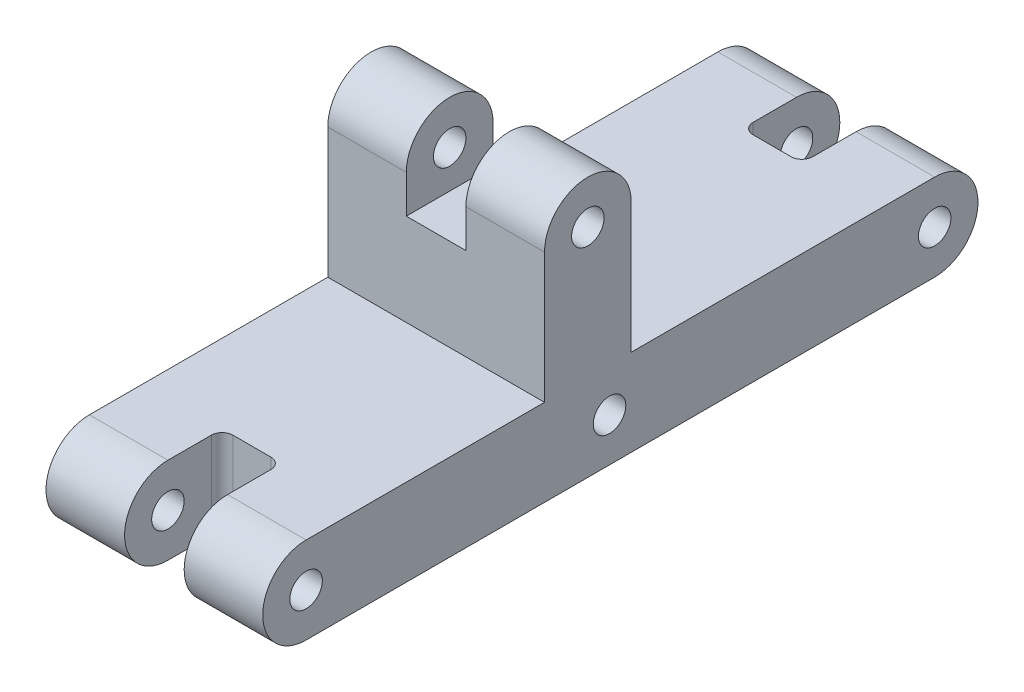
ISO-10303-21;
HEADER;
FILE_DESCRIPTION(('STEP AP214'),'2;1');
FILE_NAME('part.step','',(''),(''),'','','');
FILE_SCHEMA(('AUTOMOTIVE_DESIGN { 1 0 10303 214 1 1 1 1 }'));
ENDSEC;
DATA;
#1=APPLICATION_CONTEXT('core data for automotive mechanical design processes');
#2=APPLICATION_PROTOCOL_DEFINITION('international standard','automotive_design',2000,#1);
#3=PRODUCT_CONTEXT('',#1,'mechanical');
#4=PRODUCT('Part','Part','',(#3));
#5=PRODUCT_RELATED_PRODUCT_CATEGORY('part','',(#4));
#6=PRODUCT_DEFINITION_FORMATION('','',#4);
#7=PRODUCT_DEFINITION_CONTEXT('part definition',#1,'design');
#8=PRODUCT_DEFINITION('design','',#6,#7);
#9=PRODUCT_DEFINITION_SHAPE('','',#8);
#10=(LENGTH_UNIT() NAMED_UNIT(*) SI_UNIT(.MILLI.,.METRE.));
#11=(NAMED_UNIT(*) PLANE_ANGLE_UNIT() SI_UNIT($,.RADIAN.));
#12=(NAMED_UNIT(*) SI_UNIT($,.STERADIAN.) SOLID_ANGLE_UNIT());
#13=UNCERTAINTY_MEASURE_WITH_UNIT(LENGTH_MEASURE(1.E-05),#10,'distance_accuracy_value','');
#14=(GEOMETRIC_REPRESENTATION_CONTEXT(3) GLOBAL_UNCERTAINTY_ASSIGNED_CONTEXT((#13)) GLOBAL_UNIT_ASSIGNED_CONTEXT((#10,
#11,#12)) REPRESENTATION_CONTEXT('',''));
#15=CARTESIAN_POINT('',(0.,0.,0.));
#16=DIRECTION('',(0.,0.,1.));
#17=DIRECTION('',(1.,0.,0.));
#18=AXIS2_PLACEMENT_3D('',#15,#16,#17);
#19=CARTESIAN_POINT('',(10.,0.,43.));
#20=DIRECTION('',(-1.,0.,0.));
#21=DIRECTION('',(0.,0.,1.));
#22=AXIS2_PLACEMENT_3D('',#19,#20,#21);
#23=CYLINDRICAL_SURFACE('',#22,3.99999999999999);
#24=CARTESIAN_POINT('',(2.75,0.,43.));
#25=DIRECTION('',(-1.,0.,0.));
#26=DIRECTION('',(0.,0.,1.));
#27=AXIS2_PLACEMENT_3D('',#24,#25,#26);
#28=CIRCLE('',#27,3.99999999999999);
#29=CARTESIAN_POINT('',(2.75,-3.99999999999999,43.));
#30=VERTEX_POINT('',#29);
#31=CARTESIAN_POINT('',(2.75,4.,43.));
#32=VERTEX_POINT('',#31);
#33=EDGE_CURVE('E256',#30,#32,#28,.T.);
#34=ORIENTED_EDGE('',*,*,#33,.F.);
#35=DIRECTION('',(-1.,0.,0.));
#36=VECTOR('',#35,1.);
#37=CARTESIAN_POINT('',(10.,-3.99999999999999,43.));
#38=LINE('',#37,#36);
#39=CARTESIAN_POINT('',(10.,-3.99999999999999,43.));
#40=VERTEX_POINT('',#39);
#41=EDGE_CURVE('E359',#40,#30,#38,.T.);
#42=ORIENTED_EDGE('',*,*,#41,.F.);
#43=CARTESIAN_POINT('',(10.,0.,43.));
#44=DIRECTION('',(1.,0.,0.));
#45=DIRECTION('',(0.,0.,-1.));
#46=AXIS2_PLACEMENT_3D('',#43,#44,#45);
#47=CIRCLE('',#46,3.99999999999999);
#48=CARTESIAN_POINT('',(10.,3.99999999999999,43.));
#49=VERTEX_POINT('',#48);
#50=EDGE_CURVE('E302',#49,#40,#47,.T.);
#51=ORIENTED_EDGE('',*,*,#50,.F.);
#52=DIRECTION('',(-1.,0.,0.));
#53=VECTOR('',#52,1.);
#54=CARTESIAN_POINT('',(10.,3.99999999999999,43.));
#55=LINE('',#54,#53);
#56=EDGE_CURVE('E363',#49,#32,#55,.T.);
#57=ORIENTED_EDGE('',*,*,#56,.T.);
#58=EDGE_LOOP('',(#34,#42,#51,#57));
#59=FACE_BOUND('',#58,.T.);
#60=ADVANCED_FACE('F33',(#59),#23,.T.);
#61=CARTESIAN_POINT('',(10.,-4.,15.));
#62=DIRECTION('',(0.,1.,0.));
#63=DIRECTION('',(0.,0.,1.));
#64=AXIS2_PLACEMENT_3D('',#61,#62,#63);
#65=PLANE('',#64);
#66=DIRECTION('',(1.,0.,0.));
#67=VECTOR('',#66,1.);
#68=CARTESIAN_POINT('',(-2.75,-3.99999999999999,38.));
#69=LINE('',#68,#67);
#70=CARTESIAN_POINT('',(-1.75,-3.99999999999999,38.));
#71=VERTEX_POINT('',#70);
#72=CARTESIAN_POINT('',(1.75,-3.99999999999999,38.));
#73=VERTEX_POINT('',#72);
#74=EDGE_CURVE('E236',#71,#73,#69,.T.);
#75=ORIENTED_EDGE('',*,*,#74,.F.);
#76=CARTESIAN_POINT('',(-1.75,-4.,39.));
#77=DIRECTION('',(0.,1.,0.));
#78=DIRECTION('',(0.,0.,1.));
#79=AXIS2_PLACEMENT_3D('',#76,#77,#78);
#80=CIRCLE('',#79,1.);
#81=CARTESIAN_POINT('',(-2.75,-3.99999999999999,39.));
#82=VERTEX_POINT('',#81);
#83=EDGE_CURVE('E11',#71,#82,#80,.T.);
#84=ORIENTED_EDGE('',*,*,#83,.T.);
#85=DIRECTION('',(0.,0.,-1.));
#86=VECTOR('',#85,1.);
#87=CARTESIAN_POINT('',(-2.75,-3.99999999999999,38.));
#88=LINE('',#87,#86);
#89=CARTESIAN_POINT('',(-2.75,-3.99999999999999,43.));
#90=VERTEX_POINT('',#89);
#91=EDGE_CURVE('E227',#90,#82,#88,.T.);
#92=ORIENTED_EDGE('',*,*,#91,.F.);
#93=CARTESIAN_POINT('',(-10.,-3.99999999999999,43.));
#94=VERTEX_POINT('',#93);
#95=EDGE_CURVE('E358',#90,#94,#38,.T.);
#96=ORIENTED_EDGE('',*,*,#95,.T.);
#97=DIRECTION('',(0.,0.,-1.));
#98=VECTOR('',#97,1.);
#99=CARTESIAN_POINT('',(-10.,-4.,15.));
#100=LINE('',#99,#98);
#101=CARTESIAN_POINT('',(-10.,-4.,-15.));
#102=VERTEX_POINT('',#101);
#103=EDGE_CURVE('E323',#94,#102,#100,.T.);
#104=ORIENTED_EDGE('',*,*,#103,.T.);
#105=DIRECTION('',(-1.,0.,0.));
#106=VECTOR('',#105,1.);
#107=CARTESIAN_POINT('',(10.,-4.,-15.));
#108=LINE('',#107,#106);
#109=CARTESIAN_POINT('',(-2.75,-3.99999999999999,-15.));
#110=VERTEX_POINT('',#109);
#111=EDGE_CURVE('E354',#110,#102,#108,.T.);
#112=ORIENTED_EDGE('',*,*,#111,.F.);
#113=DIRECTION('',(0.,0.,-1.));
#114=VECTOR('',#113,1.);
#115=CARTESIAN_POINT('',(-2.75,-3.99999999999999,-10.));
#116=LINE('',#115,#114);
#117=CARTESIAN_POINT('',(-2.75,-3.99999999999999,-11.));
#118=VERTEX_POINT('',#117);
#119=EDGE_CURVE('E241',#118,#110,#116,.T.);
#120=ORIENTED_EDGE('',*,*,#119,.F.);
#121=CARTESIAN_POINT('',(-1.75,-4.,-11.));
#122=DIRECTION('',(0.,1.,0.));
#123=DIRECTION('',(0.,0.,1.));
#124=AXIS2_PLACEMENT_3D('',#121,#122,#123);
#125=CIRCLE('',#124,1.);
#126=CARTESIAN_POINT('',(-1.75,-3.99999999999999,-10.));
#127=VERTEX_POINT('',#126);
#128=EDGE_CURVE('E401',#118,#127,#125,.T.);
#129=ORIENTED_EDGE('',*,*,#128,.T.);
#130=DIRECTION('',(1.,0.,0.));
#131=VECTOR('',#130,1.);
#132=CARTESIAN_POINT('',(-2.75,-3.99999999999999,-10.));
#133=LINE('',#132,#131);
#134=CARTESIAN_POINT('',(1.75,-3.99999999999999,-10.));
#135=VERTEX_POINT('',#134);
#136=EDGE_CURVE('E247',#127,#135,#133,.T.);
#137=ORIENTED_EDGE('',*,*,#136,.T.);
#138=CARTESIAN_POINT('',(1.75,-4.,-11.));
#139=DIRECTION('',(0.,1.,0.));
#140=DIRECTION('',(0.,0.,1.));
#141=AXIS2_PLACEMENT_3D('',#138,#139,#140);
#142=CIRCLE('',#141,1.);
#143=CARTESIAN_POINT('',(2.75,-3.99999999999999,-11.));
#144=VERTEX_POINT('',#143);
#145=EDGE_CURVE('E397',#135,#144,#142,.T.);
#146=ORIENTED_EDGE('',*,*,#145,.T.);
#147=DIRECTION('',(0.,0.,-1.));
#148=VECTOR('',#147,1.);
#149=CARTESIAN_POINT('',(2.75,-3.99999999999999,-10.));
#150=LINE('',#149,#148);
#151=CARTESIAN_POINT('',(2.75,-3.99999999999999,-15.));
#152=VERTEX_POINT('',#151);
#153=EDGE_CURVE('E248',#144,#152,#150,.T.);
#154=ORIENTED_EDGE('',*,*,#153,.T.);
#155=CARTESIAN_POINT('',(10.,-4.,-15.));
#156=VERTEX_POINT('',#155);
#157=EDGE_CURVE('E355',#156,#152,#108,.T.);
#158=ORIENTED_EDGE('',*,*,#157,.F.);
#159=DIRECTION('',(0.,0.,-1.));
#160=VECTOR('',#159,1.);
#161=CARTESIAN_POINT('',(10.,-4.,15.));
#162=LINE('',#161,#160);
#163=EDGE_CURVE('E305',#40,#156,#162,.T.);
#164=ORIENTED_EDGE('',*,*,#163,.F.);
#165=ORIENTED_EDGE('',*,*,#41,.T.);
#166=DIRECTION('',(0.,0.,-1.));
#167=VECTOR('',#166,1.);
#168=CARTESIAN_POINT('',(2.75,-3.99999999999999,38.));
#169=LINE('',#168,#167);
#170=CARTESIAN_POINT('',(2.75,-3.99999999999999,39.));
#171=VERTEX_POINT('',#170);
#172=EDGE_CURVE('E228',#30,#171,#169,.T.);
#173=ORIENTED_EDGE('',*,*,#172,.T.);
#174=CARTESIAN_POINT('',(1.75,-4.,39.));
#175=DIRECTION('',(0.,1.,0.));
#176=DIRECTION('',(0.,0.,1.));
#177=AXIS2_PLACEMENT_3D('',#174,#175,#176);
#178=CIRCLE('',#177,1.);
#179=EDGE_CURVE('E407',#171,#73,#178,.T.);
#180=ORIENTED_EDGE('',*,*,#179,.T.);
#181=EDGE_LOOP('',(#75,#84,#92,#96,#104,#112,#120,#129,#137,#146,#154,#158,#164,#165,#173,#180));
#182=FACE_BOUND('',#181,.T.);
#183=ADVANCED_FACE('F419',(#182),#65,.F.);
#184=CARTESIAN_POINT('',(10.,0.,-15.));
#185=DIRECTION('',(-1.,0.,0.));
#186=DIRECTION('',(0.,0.,1.));
#187=AXIS2_PLACEMENT_3D('',#184,#185,#186);
#188=CYLINDRICAL_SURFACE('',#187,4.);
#189=CARTESIAN_POINT('',(-2.75,0.,-15.));
#190=DIRECTION('',(1.,0.,0.));
#191=DIRECTION('',(0.,0.,-1.));
#192=AXIS2_PLACEMENT_3D('',#189,#190,#191);
#193=CIRCLE('',#192,4.);
#194=CARTESIAN_POINT('',(-2.75,4.,-15.));
#195=VERTEX_POINT('',#194);
#196=EDGE_CURVE('E272',#110,#195,#193,.T.);
#197=ORIENTED_EDGE('',*,*,#196,.F.);
#198=ORIENTED_EDGE('',*,*,#111,.T.);
#199=CARTESIAN_POINT('',(-10.,0.,-15.));
#200=DIRECTION('',(1.,0.,0.));
#201=DIRECTION('',(0.,0.,-1.));
#202=AXIS2_PLACEMENT_3D('',#199,#200,#201);
#203=CIRCLE('',#202,4.);
#204=CARTESIAN_POINT('',(-10.,4.,-15.));
#205=VERTEX_POINT('',#204);
#206=EDGE_CURVE('E326',#102,#205,#203,.T.);
#207=ORIENTED_EDGE('',*,*,#206,.T.);
#208=DIRECTION('',(-1.,0.,0.));
#209=VECTOR('',#208,1.);
#210=CARTESIAN_POINT('',(10.,4.,-15.));
#211=LINE('',#210,#209);
#212=EDGE_CURVE('E350',#195,#205,#211,.T.);
#213=ORIENTED_EDGE('',*,*,#212,.F.);
#214=EDGE_LOOP('',(#197,#198,#207,#213));
#215=FACE_BOUND('',#214,.T.);
#216=ADVANCED_FACE('F452',(#215),#188,.T.);
#217=CARTESIAN_POINT('',(10.,4.,13.));
#218=DIRECTION('',(0.,-1.,0.));
#219=DIRECTION('',(0.,0.,-1.));
#220=AXIS2_PLACEMENT_3D('',#217,#218,#219);
#221=PLANE('',#220);
#222=DIRECTION('',(0.,0.,1.));
#223=VECTOR('',#222,1.);
#224=CARTESIAN_POINT('',(-2.75,4.,-10.));
#225=LINE('',#224,#223);
#226=CARTESIAN_POINT('',(-2.75,4.,-11.));
#227=VERTEX_POINT('',#226);
#228=EDGE_CURVE('E243',#195,#227,#225,.T.);
#229=ORIENTED_EDGE('',*,*,#228,.F.);
#230=ORIENTED_EDGE('',*,*,#212,.T.);
#231=DIRECTION('',(0.,0.,1.));
#232=VECTOR('',#231,1.);
#233=CARTESIAN_POINT('',(-10.,4.,13.));
#234=LINE('',#233,#232);
#235=CARTESIAN_POINT('',(-10.,4.,13.));
#236=VERTEX_POINT('',#235);
#237=EDGE_CURVE('E329',#205,#236,#234,.T.);
#238=ORIENTED_EDGE('',*,*,#237,.T.);
#239=DIRECTION('',(-1.,0.,0.));
#240=VECTOR('',#239,1.);
#241=CARTESIAN_POINT('',(10.,4.,13.));
#242=LINE('',#241,#240);
#243=CARTESIAN_POINT('',(10.,4.,13.));
#244=VERTEX_POINT('',#243);
#245=EDGE_CURVE('E347',#244,#236,#242,.T.);
#246=ORIENTED_EDGE('',*,*,#245,.F.);
#247=DIRECTION('',(0.,0.,1.));
#248=VECTOR('',#247,1.);
#249=CARTESIAN_POINT('',(10.,4.,13.));
#250=LINE('',#249,#248);
#251=CARTESIAN_POINT('',(10.,4.,-15.));
#252=VERTEX_POINT('',#251);
#253=EDGE_CURVE('E309',#252,#244,#250,.T.);
#254=ORIENTED_EDGE('',*,*,#253,.F.);
#255=CARTESIAN_POINT('',(2.75,4.,-15.));
#256=VERTEX_POINT('',#255);
#257=EDGE_CURVE('E351',#252,#256,#211,.T.);
#258=ORIENTED_EDGE('',*,*,#257,.T.);
#259=DIRECTION('',(0.,0.,1.));
#260=VECTOR('',#259,1.);
#261=CARTESIAN_POINT('',(2.75,4.,-10.));
#262=LINE('',#261,#260);
#263=CARTESIAN_POINT('',(2.75,4.,-11.));
#264=VERTEX_POINT('',#263);
#265=EDGE_CURVE('E244',#256,#264,#262,.T.);
#266=ORIENTED_EDGE('',*,*,#265,.T.);
#267=CARTESIAN_POINT('',(1.75,4.,-11.));
#268=DIRECTION('',(0.,-1.,0.));
#269=DIRECTION('',(0.,0.,-1.));
#270=AXIS2_PLACEMENT_3D('',#267,#268,#269);
#271=CIRCLE('',#270,1.);
#272=CARTESIAN_POINT('',(1.75,4.,-10.));
#273=VERTEX_POINT('',#272);
#274=EDGE_CURVE('E399',#264,#273,#271,.T.);
#275=ORIENTED_EDGE('',*,*,#274,.T.);
#276=DIRECTION('',(1.,0.,0.));
#277=VECTOR('',#276,1.);
#278=CARTESIAN_POINT('',(-2.75,4.,-10.));
#279=LINE('',#278,#277);
#280=CARTESIAN_POINT('',(-1.75,4.,-10.));
#281=VERTEX_POINT('',#280);
#282=EDGE_CURVE('E233',#281,#273,#279,.T.);
#283=ORIENTED_EDGE('',*,*,#282,.F.);
#284=CARTESIAN_POINT('',(-1.75,4.,-11.));
#285=DIRECTION('',(0.,-1.,0.));
#286=DIRECTION('',(0.,0.,-1.));
#287=AXIS2_PLACEMENT_3D('',#284,#285,#286);
#288=CIRCLE('',#287,1.);
#289=EDGE_CURVE('E403',#281,#227,#288,.T.);
#290=ORIENTED_EDGE('',*,*,#289,.T.);
#291=EDGE_LOOP('',(#229,#230,#238,#246,#254,#258,#266,#275,#283,#290));
#292=FACE_BOUND('',#291,.T.);
#293=ADVANCED_FACE('F448',(#292),#221,.F.);
#294=CARTESIAN_POINT('',(10.,16.,17.));
#295=DIRECTION('',(-1.,0.,0.));
#296=DIRECTION('',(0.,0.,1.));
#297=AXIS2_PLACEMENT_3D('',#294,#295,#296);
#298=CYLINDRICAL_SURFACE('',#297,4.);
#299=CARTESIAN_POINT('',(2.75,16.,17.));
#300=DIRECTION('',(-1.,0.,0.));
#301=DIRECTION('',(0.,0.,1.));
#302=AXIS2_PLACEMENT_3D('',#299,#300,#301);
#303=CIRCLE('',#302,4.);
#304=CARTESIAN_POINT('',(2.75,16.,21.));
#305=VERTEX_POINT('',#304);
#306=CARTESIAN_POINT('',(2.75,16.,13.));
#307=VERTEX_POINT('',#306);
#308=EDGE_CURVE('E264',#305,#307,#303,.T.);
#309=ORIENTED_EDGE('',*,*,#308,.F.);
#310=DIRECTION('',(-1.,0.,0.));
#311=VECTOR('',#310,1.);
#312=CARTESIAN_POINT('',(10.,16.,21.));
#313=LINE('',#312,#311);
#314=CARTESIAN_POINT('',(10.,16.,21.));
#315=VERTEX_POINT('',#314);
#316=EDGE_CURVE('E341',#315,#305,#313,.T.);
#317=ORIENTED_EDGE('',*,*,#316,.F.);
#318=CARTESIAN_POINT('',(10.,16.,17.));
#319=DIRECTION('',(1.,0.,0.));
#320=DIRECTION('',(0.,0.,-1.));
#321=AXIS2_PLACEMENT_3D('',#318,#319,#320);
#322=CIRCLE('',#321,4.);
#323=CARTESIAN_POINT('',(10.,16.,13.));
#324=VERTEX_POINT('',#323);
#325=EDGE_CURVE('E313',#324,#315,#322,.T.);
#326=ORIENTED_EDGE('',*,*,#325,.F.);
#327=DIRECTION('',(-1.,0.,0.));
#328=VECTOR('',#327,1.);
#329=CARTESIAN_POINT('',(10.,16.,13.));
#330=LINE('',#329,#328);
#331=EDGE_CURVE('E344',#324,#307,#330,.T.);
#332=ORIENTED_EDGE('',*,*,#331,.T.);
#333=EDGE_LOOP('',(#309,#317,#326,#332));
#334=FACE_BOUND('',#333,.T.);
#335=ADVANCED_FACE('F557',(#334),#298,.T.);
#336=CARTESIAN_POINT('',(10.,0.,-15.));
#337=DIRECTION('',(-1.,0.,0.));
#338=DIRECTION('',(0.,0.,1.));
#339=AXIS2_PLACEMENT_3D('',#336,#337,#338);
#340=CYLINDRICAL_SURFACE('',#339,1.5);
#341=CARTESIAN_POINT('',(-10.,0.,-15.));
#342=DIRECTION('',(1.,0.,0.));
#343=DIRECTION('',(0.,0.,-1.));
#344=AXIS2_PLACEMENT_3D('',#341,#342,#343);
#345=CIRCLE('',#344,1.5);
#346=CARTESIAN_POINT('',(-10.,0.,-16.5));
#347=VERTEX_POINT('',#346);
#348=EDGE_CURVE('E290',#347,#347,#345,.T.);
#349=ORIENTED_EDGE('',*,*,#348,.F.);
#350=EDGE_LOOP('',(#349));
#351=FACE_BOUND('',#350,.T.);
#352=CARTESIAN_POINT('',(-2.75,0.,-15.));
#353=DIRECTION('',(1.,0.,0.));
#354=DIRECTION('',(0.,0.,-1.));
#355=AXIS2_PLACEMENT_3D('',#352,#353,#354);
#356=CIRCLE('',#355,1.5);
#357=CARTESIAN_POINT('',(-2.75,0.,-16.5));
#358=VERTEX_POINT('',#357);
#359=EDGE_CURVE('E271',#358,#358,#356,.T.);
#360=ORIENTED_EDGE('',*,*,#359,.T.);
#361=EDGE_LOOP('',(#360));
#362=FACE_BOUND('',#361,.T.);
#363=ADVANCED_FACE('F549',(#351,#362),#340,.F.);
#364=CARTESIAN_POINT('',(10.,16.,17.));
#365=DIRECTION('',(-1.,0.,0.));
#366=DIRECTION('',(0.,0.,1.));
#367=AXIS2_PLACEMENT_3D('',#364,#365,#366);
#368=CYLINDRICAL_SURFACE('',#367,1.49999999999999);
#369=CARTESIAN_POINT('',(10.,16.,17.));
#370=DIRECTION('',(1.,0.,0.));
#371=DIRECTION('',(0.,0.,-1.));
#372=AXIS2_PLACEMENT_3D('',#369,#370,#371);
#373=CIRCLE('',#372,1.49999999999999);
#374=CARTESIAN_POINT('',(10.,16.,15.5));
#375=VERTEX_POINT('',#374);
#376=EDGE_CURVE('E287',#375,#375,#373,.T.);
#377=ORIENTED_EDGE('',*,*,#376,.T.);
#378=EDGE_LOOP('',(#377));
#379=FACE_BOUND('',#378,.T.);
#380=CARTESIAN_POINT('',(2.75,16.,17.));
#381=DIRECTION('',(-1.,0.,0.));
#382=DIRECTION('',(0.,0.,1.));
#383=AXIS2_PLACEMENT_3D('',#380,#381,#382);
#384=CIRCLE('',#383,1.49999999999999);
#385=CARTESIAN_POINT('',(2.75,16.,18.5));
#386=VERTEX_POINT('',#385);
#387=EDGE_CURVE('E263',#386,#386,#384,.T.);
#388=ORIENTED_EDGE('',*,*,#387,.T.);
#389=EDGE_LOOP('',(#388));
#390=FACE_BOUND('',#389,.T.);
#391=ADVANCED_FACE('F545',(#379,#390),#368,.F.);
#392=CARTESIAN_POINT('',(10.,0.,43.));
#393=DIRECTION('',(-1.,0.,0.));
#394=DIRECTION('',(0.,0.,1.));
#395=AXIS2_PLACEMENT_3D('',#392,#393,#394);
#396=CYLINDRICAL_SURFACE('',#395,1.5);
#397=CARTESIAN_POINT('',(10.,0.,43.));
#398=DIRECTION('',(1.,0.,0.));
#399=DIRECTION('',(0.,0.,-1.));
#400=AXIS2_PLACEMENT_3D('',#397,#398,#399);
#401=CIRCLE('',#400,1.5);
#402=CARTESIAN_POINT('',(10.,0.,41.5));
#403=VERTEX_POINT('',#402);
#404=EDGE_CURVE('E275',#403,#403,#401,.T.);
#405=ORIENTED_EDGE('',*,*,#404,.T.);
#406=EDGE_LOOP('',(#405));
#407=FACE_BOUND('',#406,.T.);
#408=CARTESIAN_POINT('',(2.75,0.,43.));
#409=DIRECTION('',(-1.,0.,0.));
#410=DIRECTION('',(0.,0.,1.));
#411=AXIS2_PLACEMENT_3D('',#408,#409,#410);
#412=CIRCLE('',#411,1.5);
#413=CARTESIAN_POINT('',(2.75,0.,44.5));
#414=VERTEX_POINT('',#413);
#415=EDGE_CURVE('E220',#414,#414,#412,.T.);
#416=ORIENTED_EDGE('',*,*,#415,.T.);
#417=EDGE_LOOP('',(#416));
#418=FACE_BOUND('',#417,.T.);
#419=ADVANCED_FACE('F536',(#407,#418),#396,.F.);
#420=CARTESIAN_POINT('',(10.,0.,43.));
#421=DIRECTION('',(1.,0.,0.));
#422=DIRECTION('',(0.,0.,-1.));
#423=AXIS2_PLACEMENT_3D('',#420,#421,#422);
#424=PLANE('',#423);
#425=CARTESIAN_POINT('',(10.,0.,15.));
#426=DIRECTION('',(1.,0.,0.));
#427=DIRECTION('',(0.,0.,-1.));
#428=AXIS2_PLACEMENT_3D('',#425,#426,#427);
#429=CIRCLE('',#428,1.5);
#430=CARTESIAN_POINT('',(10.,0.,13.5));
#431=VERTEX_POINT('',#430);
#432=EDGE_CURVE('E281',#431,#431,#429,.T.);
#433=ORIENTED_EDGE('',*,*,#432,.F.);
#434=EDGE_LOOP('',(#433));
#435=FACE_BOUND('',#434,.T.);
#436=CARTESIAN_POINT('',(10.,0.,-15.));
#437=DIRECTION('',(1.,0.,0.));
#438=DIRECTION('',(0.,0.,-1.));
#439=AXIS2_PLACEMENT_3D('',#436,#437,#438);
#440=CIRCLE('',#439,1.5);
#441=CARTESIAN_POINT('',(10.,0.,-16.5));
#442=VERTEX_POINT('',#441);
#443=EDGE_CURVE('E293',#442,#442,#440,.T.);
#444=ORIENTED_EDGE('',*,*,#443,.F.);
#445=EDGE_LOOP('',(#444));
#446=FACE_BOUND('',#445,.T.);
#447=DIRECTION('',(0.,0.,1.));
#448=VECTOR('',#447,1.);
#449=CARTESIAN_POINT('',(10.,4.,21.));
#450=LINE('',#449,#448);
#451=CARTESIAN_POINT('',(10.,4.,21.));
#452=VERTEX_POINT('',#451);
#453=EDGE_CURVE('E299',#452,#49,#450,.T.);
#454=ORIENTED_EDGE('',*,*,#453,.T.);
#455=ORIENTED_EDGE('',*,*,#50,.T.);
#456=ORIENTED_EDGE('',*,*,#163,.T.);
#457=CARTESIAN_POINT('',(10.,0.,-15.));
#458=DIRECTION('',(1.,0.,0.));
#459=DIRECTION('',(0.,0.,-1.));
#460=AXIS2_PLACEMENT_3D('',#457,#458,#459);
#461=CIRCLE('',#460,4.);
#462=EDGE_CURVE('E307',#156,#252,#461,.T.);
#463=ORIENTED_EDGE('',*,*,#462,.T.);
#464=ORIENTED_EDGE('',*,*,#253,.T.);
#465=DIRECTION('',(0.,1.,0.));
#466=VECTOR('',#465,1.);
#467=CARTESIAN_POINT('',(10.,4.,13.));
#468=LINE('',#467,#466);
#469=EDGE_CURVE('E311',#244,#324,#468,.T.);
#470=ORIENTED_EDGE('',*,*,#469,.T.);
#471=ORIENTED_EDGE('',*,*,#325,.T.);
#472=DIRECTION('',(0.,-1.,0.));
#473=VECTOR('',#472,1.);
#474=CARTESIAN_POINT('',(10.,4.,21.));
#475=LINE('',#474,#473);
#476=EDGE_CURVE('E315',#315,#452,#475,.T.);
#477=ORIENTED_EDGE('',*,*,#476,.T.);
#478=EDGE_LOOP('',(#454,#455,#456,#463,#464,#470,#471,#477));
#479=FACE_BOUND('',#478,.T.);
#480=ORIENTED_EDGE('',*,*,#376,.F.);
#481=EDGE_LOOP('',(#480));
#482=FACE_BOUND('',#481,.T.);
#483=ORIENTED_EDGE('',*,*,#404,.F.);
#484=EDGE_LOOP('',(#483));
#485=FACE_BOUND('',#484,.T.);
#486=ADVANCED_FACE('F484',(#435,#446,#479,#482,#485),#424,.T.);
#487=CARTESIAN_POINT('',(-10.,0.,43.));
#488=DIRECTION('',(1.,0.,0.));
#489=DIRECTION('',(0.,0.,-1.));
#490=AXIS2_PLACEMENT_3D('',#487,#488,#489);
#491=PLANE('',#490);
#492=DIRECTION('',(0.,0.,1.));
#493=VECTOR('',#492,1.);
#494=CARTESIAN_POINT('',(-10.,4.,21.));
#495=LINE('',#494,#493);
#496=CARTESIAN_POINT('',(-10.,4.,21.));
#497=VERTEX_POINT('',#496);
#498=CARTESIAN_POINT('',(-10.,3.99999999999999,43.));
#499=VERTEX_POINT('',#498);
#500=EDGE_CURVE('E296',#497,#499,#495,.T.);
#501=ORIENTED_EDGE('',*,*,#500,.F.);
#502=DIRECTION('',(0.,-1.,0.));
#503=VECTOR('',#502,1.);
#504=CARTESIAN_POINT('',(-10.,4.,21.));
#505=LINE('',#504,#503);
#506=CARTESIAN_POINT('',(-10.,16.,21.));
#507=VERTEX_POINT('',#506);
#508=EDGE_CURVE('E303',#507,#497,#505,.T.);
#509=ORIENTED_EDGE('',*,*,#508,.F.);
#510=CARTESIAN_POINT('',(-10.,16.,17.));
#511=DIRECTION('',(1.,0.,0.));
#512=DIRECTION('',(0.,0.,-1.));
#513=AXIS2_PLACEMENT_3D('',#510,#511,#512);
#514=CIRCLE('',#513,4.);
#515=CARTESIAN_POINT('',(-10.,16.,13.));
#516=VERTEX_POINT('',#515);
#517=EDGE_CURVE('E334',#516,#507,#514,.T.);
#518=ORIENTED_EDGE('',*,*,#517,.F.);
#519=DIRECTION('',(0.,1.,0.));
#520=VECTOR('',#519,1.);
#521=CARTESIAN_POINT('',(-10.,4.,13.));
#522=LINE('',#521,#520);
#523=EDGE_CURVE('E331',#236,#516,#522,.T.);
#524=ORIENTED_EDGE('',*,*,#523,.F.);
#525=ORIENTED_EDGE('',*,*,#237,.F.);
#526=ORIENTED_EDGE('',*,*,#206,.F.);
#527=ORIENTED_EDGE('',*,*,#103,.F.);
#528=CARTESIAN_POINT('',(-10.,0.,43.));
#529=DIRECTION('',(1.,0.,0.));
#530=DIRECTION('',(0.,0.,-1.));
#531=AXIS2_PLACEMENT_3D('',#528,#529,#530);
#532=CIRCLE('',#531,3.99999999999999);
#533=EDGE_CURVE('E320',#499,#94,#532,.T.);
#534=ORIENTED_EDGE('',*,*,#533,.F.);
#535=EDGE_LOOP('',(#501,#509,#518,#524,#525,#526,#527,#534));
#536=FACE_BOUND('',#535,.T.);
#537=ORIENTED_EDGE('',*,*,#348,.T.);
#538=EDGE_LOOP('',(#537));
#539=FACE_BOUND('',#538,.T.);
#540=CARTESIAN_POINT('',(-10.,16.,17.));
#541=DIRECTION('',(1.,0.,0.));
#542=DIRECTION('',(0.,0.,-1.));
#543=AXIS2_PLACEMENT_3D('',#540,#541,#542);
#544=CIRCLE('',#543,1.49999999999999);
#545=CARTESIAN_POINT('',(-10.,16.,15.5));
#546=VERTEX_POINT('',#545);
#547=EDGE_CURVE('E284',#546,#546,#544,.T.);
#548=ORIENTED_EDGE('',*,*,#547,.T.);
#549=EDGE_LOOP('',(#548));
#550=FACE_BOUND('',#549,.T.);
#551=CARTESIAN_POINT('',(-10.,0.,15.));
#552=DIRECTION('',(1.,0.,0.));
#553=DIRECTION('',(0.,0.,-1.));
#554=AXIS2_PLACEMENT_3D('',#551,#552,#553);
#555=CIRCLE('',#554,1.5);
#556=CARTESIAN_POINT('',(-10.,0.,13.5));
#557=VERTEX_POINT('',#556);
#558=EDGE_CURVE('E278',#557,#557,#555,.T.);
#559=ORIENTED_EDGE('',*,*,#558,.T.);
#560=EDGE_LOOP('',(#559));
#561=FACE_BOUND('',#560,.T.);
#562=CARTESIAN_POINT('',(-10.,0.,43.));
#563=DIRECTION('',(1.,0.,0.));
#564=DIRECTION('',(0.,0.,-1.));
#565=AXIS2_PLACEMENT_3D('',#562,#563,#564);
#566=CIRCLE('',#565,1.5);
#567=CARTESIAN_POINT('',(-10.,0.,41.5));
#568=VERTEX_POINT('',#567);
#569=EDGE_CURVE('E274',#568,#568,#566,.T.);
#570=ORIENTED_EDGE('',*,*,#569,.T.);
#571=EDGE_LOOP('',(#570));
#572=FACE_BOUND('',#571,.T.);
#573=ADVANCED_FACE('F426',(#536,#539,#550,#561,#572),#491,.F.);
#574=CARTESIAN_POINT('',(10.,4.,21.));
#575=DIRECTION('',(0.,-1.,0.));
#576=DIRECTION('',(0.,0.,-1.));
#577=AXIS2_PLACEMENT_3D('',#574,#575,#576);
#578=PLANE('',#577);
#579=CARTESIAN_POINT('',(-2.75,4.,43.));
#580=VERTEX_POINT('',#579);
#581=EDGE_CURVE('E362',#580,#499,#55,.T.);
#582=ORIENTED_EDGE('',*,*,#581,.F.);
#583=DIRECTION('',(0.,0.,1.));
#584=VECTOR('',#583,1.);
#585=CARTESIAN_POINT('',(-2.75,4.,38.));
#586=LINE('',#585,#584);
#587=CARTESIAN_POINT('',(-2.75,4.,39.));
#588=VERTEX_POINT('',#587);
#589=EDGE_CURVE('E225',#588,#580,#586,.T.);
#590=ORIENTED_EDGE('',*,*,#589,.F.);
#591=CARTESIAN_POINT('',(-1.75,3.99999999999999,39.));
#592=DIRECTION('',(0.,-1.,0.));
#593=DIRECTION('',(0.,0.,-1.));
#594=AXIS2_PLACEMENT_3D('',#591,#592,#593);
#595=CIRCLE('',#594,1.);
#596=CARTESIAN_POINT('',(-1.75,4.,38.));
#597=VERTEX_POINT('',#596);
#598=EDGE_CURVE('E41',#588,#597,#595,.T.);
#599=ORIENTED_EDGE('',*,*,#598,.T.);
#600=DIRECTION('',(1.,0.,0.));
#601=VECTOR('',#600,1.);
#602=CARTESIAN_POINT('',(-2.75,4.,38.));
#603=LINE('',#602,#601);
#604=CARTESIAN_POINT('',(1.75,4.,38.));
#605=VERTEX_POINT('',#604);
#606=EDGE_CURVE('E230',#597,#605,#603,.T.);
#607=ORIENTED_EDGE('',*,*,#606,.T.);
#608=CARTESIAN_POINT('',(1.75,3.99999999999999,39.));
#609=DIRECTION('',(0.,-1.,0.));
#610=DIRECTION('',(0.,0.,-1.));
#611=AXIS2_PLACEMENT_3D('',#608,#609,#610);
#612=CIRCLE('',#611,1.);
#613=CARTESIAN_POINT('',(2.75,4.,39.));
#614=VERTEX_POINT('',#613);
#615=EDGE_CURVE('E405',#605,#614,#612,.T.);
#616=ORIENTED_EDGE('',*,*,#615,.T.);
#617=DIRECTION('',(0.,0.,1.));
#618=VECTOR('',#617,1.);
#619=CARTESIAN_POINT('',(2.75,4.,38.));
#620=LINE('',#619,#618);
#621=EDGE_CURVE('E231',#614,#32,#620,.T.);
#622=ORIENTED_EDGE('',*,*,#621,.T.);
#623=ORIENTED_EDGE('',*,*,#56,.F.);
#624=ORIENTED_EDGE('',*,*,#453,.F.);
#625=DIRECTION('',(-1.,0.,0.));
#626=VECTOR('',#625,1.);
#627=CARTESIAN_POINT('',(10.,4.,21.));
#628=LINE('',#627,#626);
#629=EDGE_CURVE('E317',#452,#497,#628,.T.);
#630=ORIENTED_EDGE('',*,*,#629,.T.);
#631=ORIENTED_EDGE('',*,*,#500,.T.);
#632=EDGE_LOOP('',(#582,#590,#599,#607,#616,#622,#623,#624,#630,#631));
#633=FACE_BOUND('',#632,.T.);
#634=ADVANCED_FACE('F412',(#633),#578,.F.);
#635=CARTESIAN_POINT('',(-2.75,0.,43.));
#636=DIRECTION('',(-1.,0.,0.));
#637=DIRECTION('',(0.,0.,1.));
#638=AXIS2_PLACEMENT_3D('',#635,#636,#637);
#639=CIRCLE('',#638,3.99999999999999);
#640=EDGE_CURVE('E260',#90,#580,#639,.T.);
#641=ORIENTED_EDGE('',*,*,#640,.T.);
#642=ORIENTED_EDGE('',*,*,#581,.T.);
#643=ORIENTED_EDGE('',*,*,#533,.T.);
#644=ORIENTED_EDGE('',*,*,#95,.F.);
#645=EDGE_LOOP('',(#641,#642,#643,#644));
#646=FACE_BOUND('',#645,.T.);
#647=ADVANCED_FACE('F422',(#646),#23,.T.);
#648=CARTESIAN_POINT('',(2.75,0.,-15.));
#649=DIRECTION('',(1.,0.,0.));
#650=DIRECTION('',(0.,0.,-1.));
#651=AXIS2_PLACEMENT_3D('',#648,#649,#650);
#652=CIRCLE('',#651,4.);
#653=EDGE_CURVE('E269',#152,#256,#652,.T.);
#654=ORIENTED_EDGE('',*,*,#653,.T.);
#655=ORIENTED_EDGE('',*,*,#257,.F.);
#656=ORIENTED_EDGE('',*,*,#462,.F.);
#657=ORIENTED_EDGE('',*,*,#157,.T.);
#658=EDGE_LOOP('',(#654,#655,#656,#657));
#659=FACE_BOUND('',#658,.T.);
#660=ADVANCED_FACE('F480',(#659),#188,.T.);
#661=CARTESIAN_POINT('',(10.,4.,13.));
#662=DIRECTION('',(0.,0.,1.));
#663=DIRECTION('',(0.,-1.,0.));
#664=AXIS2_PLACEMENT_3D('',#661,#662,#663);
#665=PLANE('',#664);
#666=CARTESIAN_POINT('',(-2.75,16.,13.));
#667=VERTEX_POINT('',#666);
#668=EDGE_CURVE('E343',#667,#516,#330,.T.);
#669=ORIENTED_EDGE('',*,*,#668,.F.);
#670=DIRECTION('',(0.,1.,0.));
#671=VECTOR('',#670,1.);
#672=CARTESIAN_POINT('',(-2.75,12.5,13.));
#673=LINE('',#672,#671);
#674=CARTESIAN_POINT('',(-2.75,12.5,13.));
#675=VERTEX_POINT('',#674);
#676=EDGE_CURVE('E214',#675,#667,#673,.T.);
#677=ORIENTED_EDGE('',*,*,#676,.F.);
#678=DIRECTION('',(1.,0.,0.));
#679=VECTOR('',#678,1.);
#680=CARTESIAN_POINT('',(-2.75,12.5,13.));
#681=LINE('',#680,#679);
#682=CARTESIAN_POINT('',(2.75,12.5,13.));
#683=VERTEX_POINT('',#682);
#684=EDGE_CURVE('E213',#675,#683,#681,.T.);
#685=ORIENTED_EDGE('',*,*,#684,.T.);
#686=DIRECTION('',(0.,1.,0.));
#687=VECTOR('',#686,1.);
#688=CARTESIAN_POINT('',(2.75,12.5,13.));
#689=LINE('',#688,#687);
#690=EDGE_CURVE('E204',#683,#307,#689,.T.);
#691=ORIENTED_EDGE('',*,*,#690,.T.);
#692=ORIENTED_EDGE('',*,*,#331,.F.);
#693=ORIENTED_EDGE('',*,*,#469,.F.);
#694=ORIENTED_EDGE('',*,*,#245,.T.);
#695=ORIENTED_EDGE('',*,*,#523,.T.);
#696=EDGE_LOOP('',(#669,#677,#685,#691,#692,#693,#694,#695));
#697=FACE_BOUND('',#696,.T.);
#698=ADVANCED_FACE('F441',(#697),#665,.F.);
#699=CARTESIAN_POINT('',(-2.75,16.,21.));
#700=VERTEX_POINT('',#699);
#701=EDGE_CURVE('E340',#700,#507,#313,.T.);
#702=ORIENTED_EDGE('',*,*,#701,.F.);
#703=CARTESIAN_POINT('',(-2.75,16.,17.));
#704=DIRECTION('',(-1.,0.,0.));
#705=DIRECTION('',(0.,0.,1.));
#706=AXIS2_PLACEMENT_3D('',#703,#704,#705);
#707=CIRCLE('',#706,4.);
#708=EDGE_CURVE('E200',#700,#667,#707,.T.);
#709=ORIENTED_EDGE('',*,*,#708,.T.);
#710=ORIENTED_EDGE('',*,*,#668,.T.);
#711=ORIENTED_EDGE('',*,*,#517,.T.);
#712=EDGE_LOOP('',(#702,#709,#710,#711));
#713=FACE_BOUND('',#712,.T.);
#714=ADVANCED_FACE('F438',(#713),#298,.T.);
#715=CARTESIAN_POINT('',(10.,4.,21.));
#716=DIRECTION('',(0.,0.,-1.));
#717=DIRECTION('',(-1.,0.,0.));
#718=AXIS2_PLACEMENT_3D('',#715,#716,#717);
#719=PLANE('',#718);
#720=DIRECTION('',(1.,0.,0.));
#721=VECTOR('',#720,1.);
#722=CARTESIAN_POINT('',(-2.75,12.5,21.));
#723=LINE('',#722,#721);
#724=CARTESIAN_POINT('',(-2.75,12.5,21.));
#725=VERTEX_POINT('',#724);
#726=CARTESIAN_POINT('',(2.75,12.5,21.));
#727=VERTEX_POINT('',#726);
#728=EDGE_CURVE('E210',#725,#727,#723,.T.);
#729=ORIENTED_EDGE('',*,*,#728,.F.);
#730=DIRECTION('',(0.,-1.,0.));
#731=VECTOR('',#730,1.);
#732=CARTESIAN_POINT('',(-2.75,12.5,21.));
#733=LINE('',#732,#731);
#734=EDGE_CURVE('E194',#700,#725,#733,.T.);
#735=ORIENTED_EDGE('',*,*,#734,.F.);
#736=ORIENTED_EDGE('',*,*,#701,.T.);
#737=ORIENTED_EDGE('',*,*,#508,.T.);
#738=ORIENTED_EDGE('',*,*,#629,.F.);
#739=ORIENTED_EDGE('',*,*,#476,.F.);
#740=ORIENTED_EDGE('',*,*,#316,.T.);
#741=DIRECTION('',(0.,-1.,0.));
#742=VECTOR('',#741,1.);
#743=CARTESIAN_POINT('',(2.75,12.5,21.));
#744=LINE('',#743,#742);
#745=EDGE_CURVE('E218',#305,#727,#744,.T.);
#746=ORIENTED_EDGE('',*,*,#745,.T.);
#747=EDGE_LOOP('',(#729,#735,#736,#737,#738,#739,#740,#746));
#748=FACE_BOUND('',#747,.T.);
#749=ADVANCED_FACE('F216',(#748),#719,.F.);
#750=CARTESIAN_POINT('',(2.75,0.,-15.));
#751=DIRECTION('',(1.,0.,0.));
#752=DIRECTION('',(0.,0.,-1.));
#753=AXIS2_PLACEMENT_3D('',#750,#751,#752);
#754=CIRCLE('',#753,1.5);
#755=CARTESIAN_POINT('',(2.75,0.,-16.5));
#756=VERTEX_POINT('',#755);
#757=EDGE_CURVE('E268',#756,#756,#754,.T.);
#758=ORIENTED_EDGE('',*,*,#757,.F.);
#759=EDGE_LOOP('',(#758));
#760=FACE_BOUND('',#759,.T.);
#761=ORIENTED_EDGE('',*,*,#443,.T.);
#762=EDGE_LOOP('',(#761));
#763=FACE_BOUND('',#762,.T.);
#764=ADVANCED_FACE('F543',(#760,#763),#340,.F.);
#765=CARTESIAN_POINT('',(-2.75,16.,17.));
#766=DIRECTION('',(-1.,0.,0.));
#767=DIRECTION('',(0.,0.,1.));
#768=AXIS2_PLACEMENT_3D('',#765,#766,#767);
#769=CIRCLE('',#768,1.49999999999999);
#770=CARTESIAN_POINT('',(-2.75,16.,18.5));
#771=VERTEX_POINT('',#770);
#772=EDGE_CURVE('E266',#771,#771,#769,.T.);
#773=ORIENTED_EDGE('',*,*,#772,.F.);
#774=EDGE_LOOP('',(#773));
#775=FACE_BOUND('',#774,.T.);
#776=ORIENTED_EDGE('',*,*,#547,.F.);
#777=EDGE_LOOP('',(#776));
#778=FACE_BOUND('',#777,.T.);
#779=ADVANCED_FACE('F539',(#775,#778),#368,.F.);
#780=CARTESIAN_POINT('',(10.,0.,15.));
#781=DIRECTION('',(-1.,0.,0.));
#782=DIRECTION('',(0.,0.,1.));
#783=AXIS2_PLACEMENT_3D('',#780,#781,#782);
#784=CYLINDRICAL_SURFACE('',#783,1.5);
#785=ORIENTED_EDGE('',*,*,#432,.T.);
#786=EDGE_LOOP('',(#785));
#787=FACE_BOUND('',#786,.T.);
#788=ORIENTED_EDGE('',*,*,#558,.F.);
#789=EDGE_LOOP('',(#788));
#790=FACE_BOUND('',#789,.T.);
#791=ADVANCED_FACE('F534',(#787,#790),#784,.F.);
#792=CARTESIAN_POINT('',(-2.75,0.,43.));
#793=DIRECTION('',(-1.,0.,0.));
#794=DIRECTION('',(0.,0.,1.));
#795=AXIS2_PLACEMENT_3D('',#792,#793,#794);
#796=CIRCLE('',#795,1.5);
#797=CARTESIAN_POINT('',(-2.75,0.,44.5));
#798=VERTEX_POINT('',#797);
#799=EDGE_CURVE('E259',#798,#798,#796,.T.);
#800=ORIENTED_EDGE('',*,*,#799,.F.);
#801=EDGE_LOOP('',(#800));
#802=FACE_BOUND('',#801,.T.);
#803=ORIENTED_EDGE('',*,*,#569,.F.);
#804=EDGE_LOOP('',(#803));
#805=FACE_BOUND('',#804,.T.);
#806=ADVANCED_FACE('F531',(#802,#805),#396,.F.);
#807=CARTESIAN_POINT('',(-2.75,0.,0.));
#808=DIRECTION('',(-1.,0.,0.));
#809=DIRECTION('',(0.,0.,1.));
#810=AXIS2_PLACEMENT_3D('',#807,#808,#809);
#811=PLANE('',#810);
#812=ORIENTED_EDGE('',*,*,#799,.T.);
#813=EDGE_LOOP('',(#812));
#814=FACE_BOUND('',#813,.T.);
#815=ORIENTED_EDGE('',*,*,#91,.T.);
#816=DIRECTION('',(0.,1.,0.));
#817=VECTOR('',#816,1.);
#818=CARTESIAN_POINT('',(-2.75,4.,39.));
#819=LINE('',#818,#817);
#820=EDGE_CURVE('E395',#82,#588,#819,.T.);
#821=ORIENTED_EDGE('',*,*,#820,.T.);
#822=ORIENTED_EDGE('',*,*,#589,.T.);
#823=ORIENTED_EDGE('',*,*,#640,.F.);
#824=EDGE_LOOP('',(#815,#821,#822,#823));
#825=FACE_BOUND('',#824,.T.);
#826=ADVANCED_FACE('F417',(#814,#825),#811,.F.);
#827=CARTESIAN_POINT('',(2.75,0.,0.));
#828=DIRECTION('',(-1.,0.,0.));
#829=DIRECTION('',(0.,0.,1.));
#830=AXIS2_PLACEMENT_3D('',#827,#828,#829);
#831=PLANE('',#830);
#832=ORIENTED_EDGE('',*,*,#415,.F.);
#833=EDGE_LOOP('',(#832));
#834=FACE_BOUND('',#833,.T.);
#835=ORIENTED_EDGE('',*,*,#621,.F.);
#836=DIRECTION('',(0.,1.,0.));
#837=VECTOR('',#836,1.);
#838=CARTESIAN_POINT('',(2.75,0.,39.));
#839=LINE('',#838,#837);
#840=EDGE_CURVE('E393',#614,#171,#839,.F.);
#841=ORIENTED_EDGE('',*,*,#840,.T.);
#842=ORIENTED_EDGE('',*,*,#172,.F.);
#843=ORIENTED_EDGE('',*,*,#33,.T.);
#844=EDGE_LOOP('',(#835,#841,#842,#843));
#845=FACE_BOUND('',#844,.T.);
#846=ADVANCED_FACE('F490',(#834,#845),#831,.T.);
#847=CARTESIAN_POINT('',(-2.75,4.,38.));
#848=DIRECTION('',(0.,0.,-1.));
#849=DIRECTION('',(-1.,0.,0.));
#850=AXIS2_PLACEMENT_3D('',#847,#848,#849);
#851=PLANE('',#850);
#852=ORIENTED_EDGE('',*,*,#74,.T.);
#853=DIRECTION('',(0.,1.,0.));
#854=VECTOR('',#853,1.);
#855=CARTESIAN_POINT('',(1.75,4.,38.));
#856=LINE('',#855,#854);
#857=EDGE_CURVE('E390',#73,#605,#856,.T.);
#858=ORIENTED_EDGE('',*,*,#857,.T.);
#859=ORIENTED_EDGE('',*,*,#606,.F.);
#860=DIRECTION('',(0.,1.,0.));
#861=VECTOR('',#860,1.);
#862=CARTESIAN_POINT('',(-1.75,-3.99999999999999,38.));
#863=LINE('',#862,#861);
#864=EDGE_CURVE('E388',#597,#71,#863,.F.);
#865=ORIENTED_EDGE('',*,*,#864,.T.);
#866=EDGE_LOOP('',(#852,#858,#859,#865));
#867=FACE_BOUND('',#866,.T.);
#868=ADVANCED_FACE('F414',(#867),#851,.F.);
#869=CARTESIAN_POINT('',(-2.75,0.,0.));
#870=DIRECTION('',(-1.,0.,0.));
#871=DIRECTION('',(0.,0.,1.));
#872=AXIS2_PLACEMENT_3D('',#869,#870,#871);
#873=PLANE('',#872);
#874=ORIENTED_EDGE('',*,*,#772,.T.);
#875=EDGE_LOOP('',(#874));
#876=FACE_BOUND('',#875,.T.);
#877=ORIENTED_EDGE('',*,*,#734,.T.);
#878=DIRECTION('',(0.,0.,-1.));
#879=VECTOR('',#878,1.);
#880=CARTESIAN_POINT('',(-2.75,12.5,21.));
#881=LINE('',#880,#879);
#882=EDGE_CURVE('E198',#725,#675,#881,.T.);
#883=ORIENTED_EDGE('',*,*,#882,.T.);
#884=ORIENTED_EDGE('',*,*,#676,.T.);
#885=ORIENTED_EDGE('',*,*,#708,.F.);
#886=EDGE_LOOP('',(#877,#883,#884,#885));
#887=FACE_BOUND('',#886,.T.);
#888=ADVANCED_FACE('F196',(#876,#887),#873,.F.);
#889=CARTESIAN_POINT('',(2.75,0.,0.));
#890=DIRECTION('',(-1.,0.,0.));
#891=DIRECTION('',(0.,0.,1.));
#892=AXIS2_PLACEMENT_3D('',#889,#890,#891);
#893=PLANE('',#892);
#894=ORIENTED_EDGE('',*,*,#387,.F.);
#895=EDGE_LOOP('',(#894));
#896=FACE_BOUND('',#895,.T.);
#897=ORIENTED_EDGE('',*,*,#308,.T.);
#898=ORIENTED_EDGE('',*,*,#690,.F.);
#899=DIRECTION('',(0.,0.,-1.));
#900=VECTOR('',#899,1.);
#901=CARTESIAN_POINT('',(2.75,12.5,21.));
#902=LINE('',#901,#900);
#903=EDGE_CURVE('E771',#727,#683,#902,.T.);
#904=ORIENTED_EDGE('',*,*,#903,.F.);
#905=ORIENTED_EDGE('',*,*,#745,.F.);
#906=EDGE_LOOP('',(#897,#898,#904,#905));
#907=FACE_BOUND('',#906,.T.);
#908=ADVANCED_FACE('F663',(#896,#907),#893,.T.);
#909=CARTESIAN_POINT('',(-2.75,12.5,21.));
#910=DIRECTION('',(0.,-1.,0.));
#911=DIRECTION('',(0.,0.,-1.));
#912=AXIS2_PLACEMENT_3D('',#909,#910,#911);
#913=PLANE('',#912);
#914=ORIENTED_EDGE('',*,*,#903,.T.);
#915=ORIENTED_EDGE('',*,*,#684,.F.);
#916=ORIENTED_EDGE('',*,*,#882,.F.);
#917=ORIENTED_EDGE('',*,*,#728,.T.);
#918=EDGE_LOOP('',(#914,#915,#916,#917));
#919=FACE_BOUND('',#918,.T.);
#920=ADVANCED_FACE('F209',(#919),#913,.F.);
#921=CARTESIAN_POINT('',(-2.75,0.,0.));
#922=DIRECTION('',(1.,0.,0.));
#923=DIRECTION('',(0.,0.,-1.));
#924=AXIS2_PLACEMENT_3D('',#921,#922,#923);
#925=PLANE('',#924);
#926=ORIENTED_EDGE('',*,*,#359,.F.);
#927=EDGE_LOOP('',(#926));
#928=FACE_BOUND('',#927,.T.);
#929=ORIENTED_EDGE('',*,*,#228,.T.);
#930=DIRECTION('',(0.,-1.,0.));
#931=VECTOR('',#930,1.);
#932=CARTESIAN_POINT('',(-2.75,0.,-11.));
#933=LINE('',#932,#931);
#934=EDGE_CURVE('E385',#227,#118,#933,.T.);
#935=ORIENTED_EDGE('',*,*,#934,.T.);
#936=ORIENTED_EDGE('',*,*,#119,.T.);
#937=ORIENTED_EDGE('',*,*,#196,.T.);
#938=EDGE_LOOP('',(#929,#935,#936,#937));
#939=FACE_BOUND('',#938,.T.);
#940=ADVANCED_FACE('F457',(#928,#939),#925,.T.);
#941=CARTESIAN_POINT('',(2.75,0.,0.));
#942=DIRECTION('',(1.,0.,0.));
#943=DIRECTION('',(0.,0.,-1.));
#944=AXIS2_PLACEMENT_3D('',#941,#942,#943);
#945=PLANE('',#944);
#946=ORIENTED_EDGE('',*,*,#757,.T.);
#947=EDGE_LOOP('',(#946));
#948=FACE_BOUND('',#947,.T.);
#949=ORIENTED_EDGE('',*,*,#153,.F.);
#950=DIRECTION('',(0.,-1.,0.));
#951=VECTOR('',#950,1.);
#952=CARTESIAN_POINT('',(2.75,4.,-11.));
#953=LINE('',#952,#951);
#954=EDGE_CURVE('E383',#144,#264,#953,.F.);
#955=ORIENTED_EDGE('',*,*,#954,.T.);
#956=ORIENTED_EDGE('',*,*,#265,.F.);
#957=ORIENTED_EDGE('',*,*,#653,.F.);
#958=EDGE_LOOP('',(#949,#955,#956,#957));
#959=FACE_BOUND('',#958,.T.);
#960=ADVANCED_FACE('F476',(#948,#959),#945,.F.);
#961=CARTESIAN_POINT('',(-2.75,4.,-10.));
#962=DIRECTION('',(0.,0.,1.));
#963=DIRECTION('',(0.,-1.,0.));
#964=AXIS2_PLACEMENT_3D('',#961,#962,#963);
#965=PLANE('',#964);
#966=ORIENTED_EDGE('',*,*,#282,.T.);
#967=DIRECTION('',(0.,-1.,0.));
#968=VECTOR('',#967,1.);
#969=CARTESIAN_POINT('',(1.75,-3.99999999999999,-10.));
#970=LINE('',#969,#968);
#971=EDGE_CURVE('E380',#273,#135,#970,.T.);
#972=ORIENTED_EDGE('',*,*,#971,.T.);
#973=ORIENTED_EDGE('',*,*,#136,.F.);
#974=DIRECTION('',(0.,-1.,0.));
#975=VECTOR('',#974,1.);
#976=CARTESIAN_POINT('',(-1.75,4.,-10.));
#977=LINE('',#976,#975);
#978=EDGE_CURVE('E366',#127,#281,#977,.F.);
#979=ORIENTED_EDGE('',*,*,#978,.T.);
#980=EDGE_LOOP('',(#966,#972,#973,#979));
#981=FACE_BOUND('',#980,.T.);
#982=ADVANCED_FACE('F465',(#981),#965,.F.);
#983=CARTESIAN_POINT('',(1.75,4.,-11.));
#984=DIRECTION('',(0.,1.,0.));
#985=DIRECTION('',(0.,0.,1.));
#986=AXIS2_PLACEMENT_3D('',#983,#984,#985);
#987=CYLINDRICAL_SURFACE('',#986,1.);
#988=ORIENTED_EDGE('',*,*,#274,.F.);
#989=ORIENTED_EDGE('',*,*,#954,.F.);
#990=ORIENTED_EDGE('',*,*,#145,.F.);
#991=ORIENTED_EDGE('',*,*,#971,.F.);
#992=EDGE_LOOP('',(#988,#989,#990,#991));
#993=FACE_BOUND('',#992,.T.);
#994=ADVANCED_FACE('F471',(#993),#987,.F.);
#995=CARTESIAN_POINT('',(-1.75,0.,-11.));
#996=DIRECTION('',(0.,-1.,0.));
#997=DIRECTION('',(0.,0.,-1.));
#998=AXIS2_PLACEMENT_3D('',#995,#996,#997);
#999=CYLINDRICAL_SURFACE('',#998,1.);
#1000=ORIENTED_EDGE('',*,*,#289,.F.);
#1001=ORIENTED_EDGE('',*,*,#978,.F.);
#1002=ORIENTED_EDGE('',*,*,#128,.F.);
#1003=ORIENTED_EDGE('',*,*,#934,.F.);
#1004=EDGE_LOOP('',(#1000,#1001,#1002,#1003));
#1005=FACE_BOUND('',#1004,.T.);
#1006=ADVANCED_FACE('F461',(#1005),#999,.F.);
#1007=CARTESIAN_POINT('',(1.75,4.,39.));
#1008=DIRECTION('',(0.,1.,0.));
#1009=DIRECTION('',(0.,0.,1.));
#1010=AXIS2_PLACEMENT_3D('',#1007,#1008,#1009);
#1011=CYLINDRICAL_SURFACE('',#1010,1.);
#1012=ORIENTED_EDGE('',*,*,#179,.F.);
#1013=ORIENTED_EDGE('',*,*,#840,.F.);
#1014=ORIENTED_EDGE('',*,*,#615,.F.);
#1015=ORIENTED_EDGE('',*,*,#857,.F.);
#1016=EDGE_LOOP('',(#1012,#1013,#1014,#1015));
#1017=FACE_BOUND('',#1016,.T.);
#1018=ADVANCED_FACE('F494',(#1017),#1011,.F.);
#1019=CARTESIAN_POINT('',(-1.75,0.,39.));
#1020=DIRECTION('',(0.,-1.,0.));
#1021=DIRECTION('',(0.,0.,-1.));
#1022=AXIS2_PLACEMENT_3D('',#1019,#1020,#1021);
#1023=CYLINDRICAL_SURFACE('',#1022,1.);
#1024=ORIENTED_EDGE('',*,*,#83,.F.);
#1025=ORIENTED_EDGE('',*,*,#864,.F.);
#1026=ORIENTED_EDGE('',*,*,#598,.F.);
#1027=ORIENTED_EDGE('',*,*,#820,.F.);
#1028=EDGE_LOOP('',(#1024,#1025,#1026,#1027));
#1029=FACE_BOUND('',#1028,.T.);
#1030=ADVANCED_FACE('F35',(#1029),#1023,.F.);
#1031=CLOSED_SHELL('',(#60,#183,#216,#293,#335,#363,#391,#419,#486,#573,#634,#647,#660,#698,
#714,#749,#764,#779,#791,#806,#826,#846,#868,#888,#908,#920,#940,#960,#982,#994,#1006,#1018,#1030));
#1032=MANIFOLD_SOLID_BREP('B2',#1031);
#1033=ADVANCED_BREP_SHAPE_REPRESENTATION('',(#18,#1032),#14);
#1034=SHAPE_DEFINITION_REPRESENTATION(#9,#1033);
ENDSEC;
END-ISO-10303-21;
